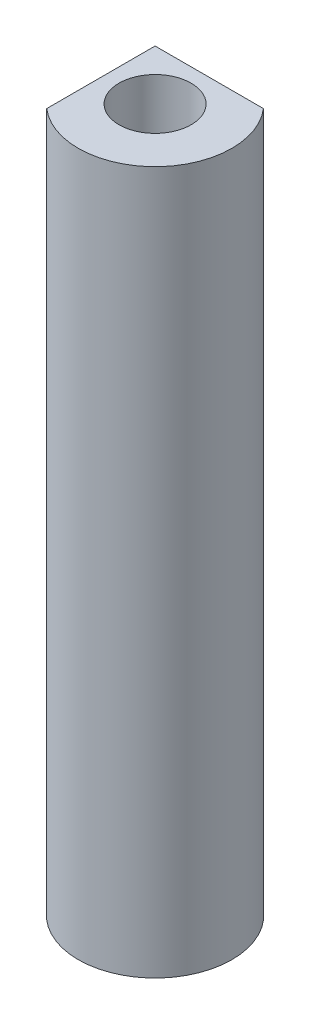
ISO-10303-21;
HEADER;
FILE_DESCRIPTION(('STEP AP214'),'2;1');
FILE_NAME('part.step','',(''),(''),'','','');
FILE_SCHEMA(('AUTOMOTIVE_DESIGN { 1 0 10303 214 1 1 1 1 }'));
ENDSEC;
DATA;
#1=APPLICATION_CONTEXT('core data for automotive mechanical design processes');
#2=APPLICATION_PROTOCOL_DEFINITION('international standard','automotive_design',2000,#1);
#3=PRODUCT_CONTEXT('',#1,'mechanical');
#4=PRODUCT('Part','Part','',(#3));
#5=PRODUCT_RELATED_PRODUCT_CATEGORY('part','',(#4));
#6=PRODUCT_DEFINITION_FORMATION('','',#4);
#7=PRODUCT_DEFINITION_CONTEXT('part definition',#1,'design');
#8=PRODUCT_DEFINITION('design','',#6,#7);
#9=PRODUCT_DEFINITION_SHAPE('','',#8);
#10=(LENGTH_UNIT() NAMED_UNIT(*) SI_UNIT(.MILLI.,.METRE.));
#11=(NAMED_UNIT(*) PLANE_ANGLE_UNIT() SI_UNIT($,.RADIAN.));
#12=(NAMED_UNIT(*) SI_UNIT($,.STERADIAN.) SOLID_ANGLE_UNIT());
#13=UNCERTAINTY_MEASURE_WITH_UNIT(LENGTH_MEASURE(1.E-05),#10,'distance_accuracy_value','');
#14=(GEOMETRIC_REPRESENTATION_CONTEXT(3) GLOBAL_UNCERTAINTY_ASSIGNED_CONTEXT((#13)) GLOBAL_UNIT_ASSIGNED_CONTEXT((#10,
#11,#12)) REPRESENTATION_CONTEXT('',''));
#15=CARTESIAN_POINT('',(0.,0.,0.));
#16=DIRECTION('',(0.,0.,1.));
#17=DIRECTION('',(1.,0.,0.));
#18=AXIS2_PLACEMENT_3D('',#15,#16,#17);
#19=CARTESIAN_POINT('',(0.,44.8,0.));
#20=DIRECTION('',(0.,1.,0.));
#21=DIRECTION('',(0.,0.,1.));
#22=AXIS2_PLACEMENT_3D('',#19,#20,#21);
#23=PLANE('',#22);
#24=DIRECTION('',(0.,0.,-1.));
#25=VECTOR('',#24,1.);
#26=CARTESIAN_POINT('',(-3.2,44.8,5.79933487507355));
#27=LINE('',#26,#25);
#28=CARTESIAN_POINT('',(-3.2,44.8,3.7107950630559));
#29=VERTEX_POINT('',#28);
#30=CARTESIAN_POINT('',(-3.2,44.8,-3.2));
#31=VERTEX_POINT('',#30);
#32=EDGE_CURVE('E77',#29,#31,#27,.T.);
#33=ORIENTED_EDGE('',*,*,#32,.F.);
#34=CARTESIAN_POINT('',(0.,44.8,0.));
#35=DIRECTION('',(0.,1.,0.));
#36=DIRECTION('',(0.,0.,1.));
#37=AXIS2_PLACEMENT_3D('',#34,#35,#36);
#38=CIRCLE('',#37,4.9);
#39=CARTESIAN_POINT('',(3.7107950630559,44.8,-3.2));
#40=VERTEX_POINT('',#39);
#41=EDGE_CURVE('E56',#29,#40,#38,.T.);
#42=ORIENTED_EDGE('',*,*,#41,.T.);
#43=DIRECTION('',(1.,0.,0.));
#44=VECTOR('',#43,1.);
#45=CARTESIAN_POINT('',(-5.5539753936884,44.8,-3.2));
#46=LINE('',#45,#44);
#47=EDGE_CURVE('E80',#31,#40,#46,.T.);
#48=ORIENTED_EDGE('',*,*,#47,.F.);
#49=EDGE_LOOP('',(#33,#42,#48));
#50=FACE_BOUND('',#49,.T.);
#51=CARTESIAN_POINT('',(0.,44.8,0.));
#52=DIRECTION('',(0.,1.,0.));
#53=DIRECTION('',(0.,0.,1.));
#54=AXIS2_PLACEMENT_3D('',#51,#52,#53);
#55=CIRCLE('',#54,2.3);
#56=CARTESIAN_POINT('',(0.,44.8,2.3));
#57=VERTEX_POINT('',#56);
#58=EDGE_CURVE('E92',#57,#57,#55,.T.);
#59=ORIENTED_EDGE('',*,*,#58,.F.);
#60=EDGE_LOOP('',(#59));
#61=FACE_BOUND('',#60,.T.);
#62=ADVANCED_FACE('F33',(#50,#61),#23,.T.);
#63=CARTESIAN_POINT('',(0.,0.,0.));
#64=DIRECTION('',(0.,1.,0.));
#65=DIRECTION('',(0.,0.,1.));
#66=AXIS2_PLACEMENT_3D('',#63,#64,#65);
#67=PLANE('',#66);
#68=CARTESIAN_POINT('',(0.,0.,0.));
#69=DIRECTION('',(0.,1.,0.));
#70=DIRECTION('',(0.,0.,1.));
#71=AXIS2_PLACEMENT_3D('',#68,#69,#70);
#72=CIRCLE('',#71,4.9);
#73=CARTESIAN_POINT('',(-3.7107950630559,0.,-3.2));
#74=VERTEX_POINT('',#73);
#75=CARTESIAN_POINT('',(3.7107950630559,0.,-3.2));
#76=VERTEX_POINT('',#75);
#77=EDGE_CURVE('E88',#74,#76,#72,.T.);
#78=ORIENTED_EDGE('',*,*,#77,.F.);
#79=DIRECTION('',(1.,0.,0.));
#80=VECTOR('',#79,1.);
#81=CARTESIAN_POINT('',(0.,0.,-3.2));
#82=LINE('',#81,#80);
#83=EDGE_CURVE('E108',#74,#76,#82,.T.);
#84=ORIENTED_EDGE('',*,*,#83,.T.);
#85=EDGE_LOOP('',(#78,#84));
#86=FACE_BOUND('',#85,.T.);
#87=CARTESIAN_POINT('',(0.,0.,0.));
#88=DIRECTION('',(0.,1.,0.));
#89=DIRECTION('',(0.,0.,1.));
#90=AXIS2_PLACEMENT_3D('',#87,#88,#89);
#91=CIRCLE('',#90,2.3);
#92=CARTESIAN_POINT('',(0.,0.,2.3));
#93=VERTEX_POINT('',#92);
#94=EDGE_CURVE('E95',#93,#93,#91,.T.);
#95=ORIENTED_EDGE('',*,*,#94,.T.);
#96=EDGE_LOOP('',(#95));
#97=FACE_BOUND('',#96,.T.);
#98=ADVANCED_FACE('F116',(#86,#97),#67,.F.);
#99=CARTESIAN_POINT('',(0.,44.8,0.));
#100=DIRECTION('',(0.,-1.,0.));
#101=DIRECTION('',(0.,0.,-1.));
#102=AXIS2_PLACEMENT_3D('',#99,#100,#101);
#103=CYLINDRICAL_SURFACE('',#102,4.9);
#104=ORIENTED_EDGE('',*,*,#41,.F.);
#105=DIRECTION('',(0.,-1.,0.));
#106=VECTOR('',#105,1.);
#107=CARTESIAN_POINT('',(-3.2,44.8,3.7107950630559));
#108=LINE('',#107,#106);
#109=CARTESIAN_POINT('',(-3.2,4.8,3.7107950630559));
#110=VERTEX_POINT('',#109);
#111=EDGE_CURVE('E75',#29,#110,#108,.T.);
#112=ORIENTED_EDGE('',*,*,#111,.T.);
#113=CARTESIAN_POINT('',(0.,4.8,0.));
#114=DIRECTION('',(0.,-1.,0.));
#115=DIRECTION('',(0.,0.,-1.));
#116=AXIS2_PLACEMENT_3D('',#113,#114,#115);
#117=CIRCLE('',#116,4.9);
#118=CARTESIAN_POINT('',(-3.7107950630559,4.8,-3.2));
#119=VERTEX_POINT('',#118);
#120=EDGE_CURVE('E81',#110,#119,#117,.T.);
#121=ORIENTED_EDGE('',*,*,#120,.T.);
#122=DIRECTION('',(0.,-1.,0.));
#123=VECTOR('',#122,1.);
#124=CARTESIAN_POINT('',(-3.7107950630559,44.8,-3.2));
#125=LINE('',#124,#123);
#126=EDGE_CURVE('E90',#119,#74,#125,.T.);
#127=ORIENTED_EDGE('',*,*,#126,.T.);
#128=ORIENTED_EDGE('',*,*,#77,.T.);
#129=DIRECTION('',(0.,-1.,0.));
#130=VECTOR('',#129,1.);
#131=CARTESIAN_POINT('',(3.7107950630559,44.8,-3.2));
#132=LINE('',#131,#130);
#133=EDGE_CURVE('E87',#76,#40,#132,.F.);
#134=ORIENTED_EDGE('',*,*,#133,.T.);
#135=EDGE_LOOP('',(#104,#112,#121,#127,#128,#134));
#136=FACE_BOUND('',#135,.T.);
#137=ADVANCED_FACE('F35',(#136),#103,.T.);
#138=CARTESIAN_POINT('',(0.,44.8,0.));
#139=DIRECTION('',(0.,-1.,0.));
#140=DIRECTION('',(0.,0.,-1.));
#141=AXIS2_PLACEMENT_3D('',#138,#139,#140);
#142=CYLINDRICAL_SURFACE('',#141,2.3);
#143=ORIENTED_EDGE('',*,*,#58,.T.);
#144=EDGE_LOOP('',(#143));
#145=FACE_BOUND('',#144,.T.);
#146=ORIENTED_EDGE('',*,*,#94,.F.);
#147=EDGE_LOOP('',(#146));
#148=FACE_BOUND('',#147,.T.);
#149=ADVANCED_FACE('F118',(#145,#148),#142,.F.);
#150=CARTESIAN_POINT('',(-5.5539753936884,-0.199999999999999,-3.2));
#151=DIRECTION('',(0.,0.,1.));
#152=DIRECTION('',(1.,0.,0.));
#153=AXIS2_PLACEMENT_3D('',#150,#151,#152);
#154=PLANE('',#153);
#155=DIRECTION('',(1.,0.,0.));
#156=VECTOR('',#155,1.);
#157=CARTESIAN_POINT('',(-5.5539753936884,4.8,-3.2));
#158=LINE('',#157,#156);
#159=CARTESIAN_POINT('',(-3.2,4.8,-3.2));
#160=VERTEX_POINT('',#159);
#161=EDGE_CURVE('E41',#119,#160,#158,.T.);
#162=ORIENTED_EDGE('',*,*,#161,.T.);
#163=DIRECTION('',(0.,1.,0.));
#164=VECTOR('',#163,1.);
#165=CARTESIAN_POINT('',(-3.2,-0.199999999999999,-3.2));
#166=LINE('',#165,#164);
#167=EDGE_CURVE('E11',#160,#31,#166,.T.);
#168=ORIENTED_EDGE('',*,*,#167,.T.);
#169=ORIENTED_EDGE('',*,*,#47,.T.);
#170=ORIENTED_EDGE('',*,*,#133,.F.);
#171=ORIENTED_EDGE('',*,*,#83,.F.);
#172=ORIENTED_EDGE('',*,*,#126,.F.);
#173=EDGE_LOOP('',(#162,#168,#169,#170,#171,#172));
#174=FACE_BOUND('',#173,.T.);
#175=ADVANCED_FACE('F101',(#174),#154,.F.);
#176=CARTESIAN_POINT('',(-3.2,4.8,5.79933487507355));
#177=DIRECTION('',(1.,0.,0.));
#178=DIRECTION('',(0.,0.,-1.));
#179=AXIS2_PLACEMENT_3D('',#176,#177,#178);
#180=PLANE('',#179);
#181=ORIENTED_EDGE('',*,*,#32,.T.);
#182=ORIENTED_EDGE('',*,*,#167,.F.);
#183=DIRECTION('',(0.,0.,-1.));
#184=VECTOR('',#183,1.);
#185=CARTESIAN_POINT('',(-3.2,4.8,5.79933487507355));
#186=LINE('',#185,#184);
#187=EDGE_CURVE('E48',#110,#160,#186,.T.);
#188=ORIENTED_EDGE('',*,*,#187,.F.);
#189=ORIENTED_EDGE('',*,*,#111,.F.);
#190=EDGE_LOOP('',(#181,#182,#188,#189));
#191=FACE_BOUND('',#190,.T.);
#192=ADVANCED_FACE('F76',(#191),#180,.F.);
#193=CARTESIAN_POINT('',(0.,4.8,0.));
#194=DIRECTION('',(0.,-1.,0.));
#195=DIRECTION('',(0.,0.,-1.));
#196=AXIS2_PLACEMENT_3D('',#193,#194,#195);
#197=PLANE('',#196);
#198=ORIENTED_EDGE('',*,*,#187,.T.);
#199=ORIENTED_EDGE('',*,*,#161,.F.);
#200=ORIENTED_EDGE('',*,*,#120,.F.);
#201=EDGE_LOOP('',(#198,#199,#200));
#202=FACE_BOUND('',#201,.T.);
#203=ADVANCED_FACE('F103',(#202),#197,.F.);
#204=CLOSED_SHELL('',(#62,#98,#137,#149,#175,#192,#203));
#205=MANIFOLD_SOLID_BREP('B2',#204);
#206=ADVANCED_BREP_SHAPE_REPRESENTATION('',(#18,#205),#14);
#207=SHAPE_DEFINITION_REPRESENTATION(#9,#206);
ENDSEC;
END-ISO-10303-21;
